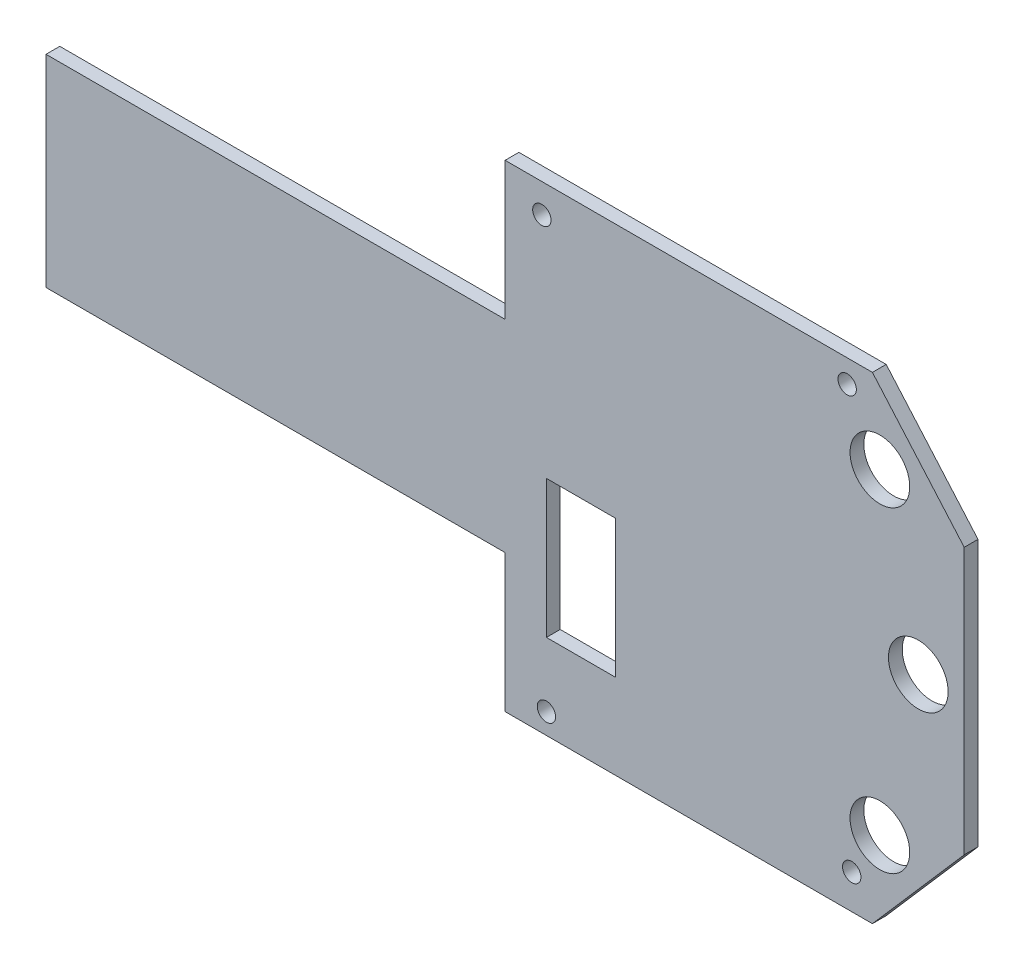
ISO-10303-21;
HEADER;
FILE_DESCRIPTION(('STEP AP214'),'2;1');
FILE_NAME('part.step','',(''),(''),'','','');
FILE_SCHEMA(('AUTOMOTIVE_DESIGN { 1 0 10303 214 1 1 1 1 }'));
ENDSEC;
DATA;
#1=APPLICATION_CONTEXT('core data for automotive mechanical design processes');
#2=APPLICATION_PROTOCOL_DEFINITION('international standard','automotive_design',2000,#1);
#3=PRODUCT_CONTEXT('',#1,'mechanical');
#4=PRODUCT('Part','Part','',(#3));
#5=PRODUCT_RELATED_PRODUCT_CATEGORY('part','',(#4));
#6=PRODUCT_DEFINITION_FORMATION('','',#4);
#7=PRODUCT_DEFINITION_CONTEXT('part definition',#1,'design');
#8=PRODUCT_DEFINITION('design','',#6,#7);
#9=PRODUCT_DEFINITION_SHAPE('','',#8);
#10=(LENGTH_UNIT() NAMED_UNIT(*) SI_UNIT(.MILLI.,.METRE.));
#11=(NAMED_UNIT(*) PLANE_ANGLE_UNIT() SI_UNIT($,.RADIAN.));
#12=(NAMED_UNIT(*) SI_UNIT($,.STERADIAN.) SOLID_ANGLE_UNIT());
#13=UNCERTAINTY_MEASURE_WITH_UNIT(LENGTH_MEASURE(1.E-05),#10,'distance_accuracy_value','');
#14=(GEOMETRIC_REPRESENTATION_CONTEXT(3) GLOBAL_UNCERTAINTY_ASSIGNED_CONTEXT((#13)) GLOBAL_UNIT_ASSIGNED_CONTEXT((#10,
#11,#12)) REPRESENTATION_CONTEXT('',''));
#15=CARTESIAN_POINT('',(0.,0.,0.));
#16=DIRECTION('',(0.,0.,1.));
#17=DIRECTION('',(1.,0.,0.));
#18=AXIS2_PLACEMENT_3D('',#15,#16,#17);
#19=CARTESIAN_POINT('',(100.,104.,3.));
#20=DIRECTION('',(1.,0.,0.));
#21=DIRECTION('',(0.,0.,-1.));
#22=AXIS2_PLACEMENT_3D('',#19,#20,#21);
#23=PLANE('',#22);
#24=DIRECTION('',(0.,-1.,0.));
#25=VECTOR('',#24,1.);
#26=CARTESIAN_POINT('',(100.,104.,0.));
#27=LINE('',#26,#25);
#28=CARTESIAN_POINT('',(100.,104.,0.));
#29=VERTEX_POINT('',#28);
#30=CARTESIAN_POINT('',(100.,74.,0.));
#31=VERTEX_POINT('',#30);
#32=EDGE_CURVE('E178',#29,#31,#27,.T.);
#33=ORIENTED_EDGE('',*,*,#32,.T.);
#34=DIRECTION('',(0.,0.,-1.));
#35=VECTOR('',#34,1.);
#36=CARTESIAN_POINT('',(100.,74.,3.));
#37=LINE('',#36,#35);
#38=CARTESIAN_POINT('',(100.,74.,3.));
#39=VERTEX_POINT('',#38);
#40=EDGE_CURVE('E280',#39,#31,#37,.T.);
#41=ORIENTED_EDGE('',*,*,#40,.F.);
#42=DIRECTION('',(0.,-1.,0.));
#43=VECTOR('',#42,1.);
#44=CARTESIAN_POINT('',(100.,104.,3.));
#45=LINE('',#44,#43);
#46=CARTESIAN_POINT('',(100.,104.,3.));
#47=VERTEX_POINT('',#46);
#48=EDGE_CURVE('E183',#47,#39,#45,.T.);
#49=ORIENTED_EDGE('',*,*,#48,.F.);
#50=DIRECTION('',(0.,0.,-1.));
#51=VECTOR('',#50,1.);
#52=CARTESIAN_POINT('',(100.,104.,3.));
#53=LINE('',#52,#51);
#54=EDGE_CURVE('E215',#47,#29,#53,.T.);
#55=ORIENTED_EDGE('',*,*,#54,.T.);
#56=EDGE_LOOP('',(#33,#41,#49,#55));
#57=FACE_BOUND('',#56,.T.);
#58=ADVANCED_FACE('F44',(#57),#23,.F.);
#59=CARTESIAN_POINT('',(0.,74.,3.));
#60=DIRECTION('',(0.,-1.,0.));
#61=DIRECTION('',(0.,0.,-1.));
#62=AXIS2_PLACEMENT_3D('',#59,#60,#61);
#63=PLANE('',#62);
#64=DIRECTION('',(-1.,0.,0.));
#65=VECTOR('',#64,1.);
#66=CARTESIAN_POINT('',(0.,74.,0.));
#67=LINE('',#66,#65);
#68=CARTESIAN_POINT('',(0.,74.,0.));
#69=VERTEX_POINT('',#68);
#70=EDGE_CURVE('E219',#31,#69,#67,.T.);
#71=ORIENTED_EDGE('',*,*,#70,.T.);
#72=DIRECTION('',(0.,0.,-1.));
#73=VECTOR('',#72,1.);
#74=CARTESIAN_POINT('',(0.,74.,3.));
#75=LINE('',#74,#73);
#76=CARTESIAN_POINT('',(0.,74.,3.));
#77=VERTEX_POINT('',#76);
#78=EDGE_CURVE('E276',#77,#69,#75,.T.);
#79=ORIENTED_EDGE('',*,*,#78,.F.);
#80=DIRECTION('',(-1.,0.,0.));
#81=VECTOR('',#80,1.);
#82=CARTESIAN_POINT('',(0.,74.,3.));
#83=LINE('',#82,#81);
#84=EDGE_CURVE('E187',#39,#77,#83,.T.);
#85=ORIENTED_EDGE('',*,*,#84,.F.);
#86=ORIENTED_EDGE('',*,*,#40,.T.);
#87=EDGE_LOOP('',(#71,#79,#85,#86));
#88=FACE_BOUND('',#87,.T.);
#89=ADVANCED_FACE('F364',(#88),#63,.F.);
#90=CARTESIAN_POINT('',(0.,30.,3.));
#91=DIRECTION('',(1.,0.,0.));
#92=DIRECTION('',(0.,0.,-1.));
#93=AXIS2_PLACEMENT_3D('',#90,#91,#92);
#94=PLANE('',#93);
#95=DIRECTION('',(0.,-1.,0.));
#96=VECTOR('',#95,1.);
#97=CARTESIAN_POINT('',(0.,30.,0.));
#98=LINE('',#97,#96);
#99=CARTESIAN_POINT('',(0.,30.,0.));
#100=VERTEX_POINT('',#99);
#101=EDGE_CURVE('E222',#69,#100,#98,.T.);
#102=ORIENTED_EDGE('',*,*,#101,.T.);
#103=DIRECTION('',(0.,0.,-1.));
#104=VECTOR('',#103,1.);
#105=CARTESIAN_POINT('',(0.,30.,3.));
#106=LINE('',#105,#104);
#107=CARTESIAN_POINT('',(0.,30.,3.));
#108=VERTEX_POINT('',#107);
#109=EDGE_CURVE('E272',#108,#100,#106,.T.);
#110=ORIENTED_EDGE('',*,*,#109,.F.);
#111=DIRECTION('',(0.,-1.,0.));
#112=VECTOR('',#111,1.);
#113=CARTESIAN_POINT('',(0.,30.,3.));
#114=LINE('',#113,#112);
#115=EDGE_CURVE('E191',#77,#108,#114,.T.);
#116=ORIENTED_EDGE('',*,*,#115,.F.);
#117=ORIENTED_EDGE('',*,*,#78,.T.);
#118=EDGE_LOOP('',(#102,#110,#116,#117));
#119=FACE_BOUND('',#118,.T.);
#120=ADVANCED_FACE('F369',(#119),#94,.F.);
#121=CARTESIAN_POINT('',(0.,30.,3.));
#122=DIRECTION('',(0.,1.,0.));
#123=DIRECTION('',(0.,0.,1.));
#124=AXIS2_PLACEMENT_3D('',#121,#122,#123);
#125=PLANE('',#124);
#126=DIRECTION('',(1.,0.,0.));
#127=VECTOR('',#126,1.);
#128=CARTESIAN_POINT('',(0.,30.,0.));
#129=LINE('',#128,#127);
#130=CARTESIAN_POINT('',(100.,30.,0.));
#131=VERTEX_POINT('',#130);
#132=EDGE_CURVE('E225',#100,#131,#129,.T.);
#133=ORIENTED_EDGE('',*,*,#132,.T.);
#134=DIRECTION('',(0.,0.,-1.));
#135=VECTOR('',#134,1.);
#136=CARTESIAN_POINT('',(100.,30.,3.));
#137=LINE('',#136,#135);
#138=CARTESIAN_POINT('',(100.,30.,3.));
#139=VERTEX_POINT('',#138);
#140=EDGE_CURVE('E268',#139,#131,#137,.T.);
#141=ORIENTED_EDGE('',*,*,#140,.F.);
#142=DIRECTION('',(1.,0.,0.));
#143=VECTOR('',#142,1.);
#144=CARTESIAN_POINT('',(0.,30.,3.));
#145=LINE('',#144,#143);
#146=EDGE_CURVE('E194',#108,#139,#145,.T.);
#147=ORIENTED_EDGE('',*,*,#146,.F.);
#148=ORIENTED_EDGE('',*,*,#109,.T.);
#149=EDGE_LOOP('',(#133,#141,#147,#148));
#150=FACE_BOUND('',#149,.T.);
#151=ADVANCED_FACE('F409',(#150),#125,.F.);
#152=CARTESIAN_POINT('',(100.,0.,3.));
#153=DIRECTION('',(1.,0.,0.));
#154=DIRECTION('',(0.,0.,-1.));
#155=AXIS2_PLACEMENT_3D('',#152,#153,#154);
#156=PLANE('',#155);
#157=DIRECTION('',(0.,-1.,0.));
#158=VECTOR('',#157,1.);
#159=CARTESIAN_POINT('',(100.,0.,0.));
#160=LINE('',#159,#158);
#161=CARTESIAN_POINT('',(100.,0.,0.));
#162=VERTEX_POINT('',#161);
#163=EDGE_CURVE('E228',#131,#162,#160,.T.);
#164=ORIENTED_EDGE('',*,*,#163,.T.);
#165=DIRECTION('',(0.,0.,-1.));
#166=VECTOR('',#165,1.);
#167=CARTESIAN_POINT('',(100.,0.,3.));
#168=LINE('',#167,#166);
#169=CARTESIAN_POINT('',(100.,0.,3.));
#170=VERTEX_POINT('',#169);
#171=EDGE_CURVE('E264',#170,#162,#168,.T.);
#172=ORIENTED_EDGE('',*,*,#171,.F.);
#173=DIRECTION('',(0.,-1.,0.));
#174=VECTOR('',#173,1.);
#175=CARTESIAN_POINT('',(100.,0.,3.));
#176=LINE('',#175,#174);
#177=EDGE_CURVE('E197',#139,#170,#176,.T.);
#178=ORIENTED_EDGE('',*,*,#177,.F.);
#179=ORIENTED_EDGE('',*,*,#140,.T.);
#180=EDGE_LOOP('',(#164,#172,#178,#179));
#181=FACE_BOUND('',#180,.T.);
#182=ADVANCED_FACE('F404',(#181),#156,.F.);
#183=CARTESIAN_POINT('',(100.,0.,3.));
#184=DIRECTION('',(0.,1.,0.));
#185=DIRECTION('',(-1.,0.,0.));
#186=AXIS2_PLACEMENT_3D('',#183,#184,#185);
#187=PLANE('',#186);
#188=DIRECTION('',(1.,0.,0.));
#189=VECTOR('',#188,1.);
#190=CARTESIAN_POINT('',(100.,0.,0.));
#191=LINE('',#190,#189);
#192=CARTESIAN_POINT('',(180.,0.,0.));
#193=VERTEX_POINT('',#192);
#194=EDGE_CURVE('E231',#162,#193,#191,.T.);
#195=ORIENTED_EDGE('',*,*,#194,.T.);
#196=DIRECTION('',(0.,0.,-1.));
#197=VECTOR('',#196,1.);
#198=CARTESIAN_POINT('',(180.,0.,3.));
#199=LINE('',#198,#197);
#200=CARTESIAN_POINT('',(180.,0.,3.));
#201=VERTEX_POINT('',#200);
#202=EDGE_CURVE('E260',#201,#193,#199,.T.);
#203=ORIENTED_EDGE('',*,*,#202,.F.);
#204=DIRECTION('',(1.,0.,0.));
#205=VECTOR('',#204,1.);
#206=CARTESIAN_POINT('',(100.,0.,3.));
#207=LINE('',#206,#205);
#208=EDGE_CURVE('E200',#170,#201,#207,.T.);
#209=ORIENTED_EDGE('',*,*,#208,.F.);
#210=ORIENTED_EDGE('',*,*,#171,.T.);
#211=EDGE_LOOP('',(#195,#203,#209,#210));
#212=FACE_BOUND('',#211,.T.);
#213=ADVANCED_FACE('F400',(#212),#187,.F.);
#214=CARTESIAN_POINT('',(200.,23.,3.));
#215=DIRECTION('',(-0.754605522163505,0.656178714924787,0.));
#216=DIRECTION('',(-0.656178714924787,-0.754605522163505,0.));
#217=AXIS2_PLACEMENT_3D('',#214,#215,#216);
#218=PLANE('',#217);
#219=DIRECTION('',(0.656178714924787,0.754605522163505,0.));
#220=VECTOR('',#219,1.);
#221=CARTESIAN_POINT('',(200.,23.,0.));
#222=LINE('',#221,#220);
#223=CARTESIAN_POINT('',(200.,23.,0.));
#224=VERTEX_POINT('',#223);
#225=EDGE_CURVE('E234',#193,#224,#222,.T.);
#226=ORIENTED_EDGE('',*,*,#225,.T.);
#227=DIRECTION('',(0.,0.,-1.));
#228=VECTOR('',#227,1.);
#229=CARTESIAN_POINT('',(200.,23.,3.));
#230=LINE('',#229,#228);
#231=CARTESIAN_POINT('',(200.,23.,3.));
#232=VERTEX_POINT('',#231);
#233=EDGE_CURVE('E256',#232,#224,#230,.T.);
#234=ORIENTED_EDGE('',*,*,#233,.F.);
#235=DIRECTION('',(0.656178714924787,0.754605522163505,0.));
#236=VECTOR('',#235,1.);
#237=CARTESIAN_POINT('',(200.,23.,3.));
#238=LINE('',#237,#236);
#239=EDGE_CURVE('E203',#201,#232,#238,.T.);
#240=ORIENTED_EDGE('',*,*,#239,.F.);
#241=ORIENTED_EDGE('',*,*,#202,.T.);
#242=EDGE_LOOP('',(#226,#234,#240,#241));
#243=FACE_BOUND('',#242,.T.);
#244=ADVANCED_FACE('F396',(#243),#218,.F.);
#245=CARTESIAN_POINT('',(200.,23.,3.));
#246=DIRECTION('',(-1.,0.,0.));
#247=DIRECTION('',(0.,0.,1.));
#248=AXIS2_PLACEMENT_3D('',#245,#246,#247);
#249=PLANE('',#248);
#250=DIRECTION('',(0.,1.,0.));
#251=VECTOR('',#250,1.);
#252=CARTESIAN_POINT('',(200.,23.,0.));
#253=LINE('',#252,#251);
#254=CARTESIAN_POINT('',(200.,81.,0.));
#255=VERTEX_POINT('',#254);
#256=EDGE_CURVE('E237',#224,#255,#253,.T.);
#257=ORIENTED_EDGE('',*,*,#256,.T.);
#258=DIRECTION('',(0.,0.,-1.));
#259=VECTOR('',#258,1.);
#260=CARTESIAN_POINT('',(200.,81.,3.));
#261=LINE('',#260,#259);
#262=CARTESIAN_POINT('',(200.,81.,3.));
#263=VERTEX_POINT('',#262);
#264=EDGE_CURVE('E252',#263,#255,#261,.T.);
#265=ORIENTED_EDGE('',*,*,#264,.F.);
#266=DIRECTION('',(0.,1.,0.));
#267=VECTOR('',#266,1.);
#268=CARTESIAN_POINT('',(200.,23.,3.));
#269=LINE('',#268,#267);
#270=EDGE_CURVE('E206',#232,#263,#269,.T.);
#271=ORIENTED_EDGE('',*,*,#270,.F.);
#272=ORIENTED_EDGE('',*,*,#233,.T.);
#273=EDGE_LOOP('',(#257,#265,#271,#272));
#274=FACE_BOUND('',#273,.T.);
#275=ADVANCED_FACE('F391',(#274),#249,.F.);
#276=CARTESIAN_POINT('',(200.,81.,3.));
#277=DIRECTION('',(-0.754605522163505,-0.656178714924787,0.));
#278=DIRECTION('',(0.656178714924787,-0.754605522163505,0.));
#279=AXIS2_PLACEMENT_3D('',#276,#277,#278);
#280=PLANE('',#279);
#281=DIRECTION('',(-0.656178714924787,0.754605522163505,0.));
#282=VECTOR('',#281,1.);
#283=CARTESIAN_POINT('',(200.,81.,0.));
#284=LINE('',#283,#282);
#285=CARTESIAN_POINT('',(180.,104.,0.));
#286=VERTEX_POINT('',#285);
#287=EDGE_CURVE('E240',#255,#286,#284,.T.);
#288=ORIENTED_EDGE('',*,*,#287,.T.);
#289=DIRECTION('',(0.,0.,-1.));
#290=VECTOR('',#289,1.);
#291=CARTESIAN_POINT('',(180.,104.,3.));
#292=LINE('',#291,#290);
#293=CARTESIAN_POINT('',(180.,104.,3.));
#294=VERTEX_POINT('',#293);
#295=EDGE_CURVE('E248',#294,#286,#292,.T.);
#296=ORIENTED_EDGE('',*,*,#295,.F.);
#297=DIRECTION('',(-0.656178714924787,0.754605522163505,0.));
#298=VECTOR('',#297,1.);
#299=CARTESIAN_POINT('',(200.,81.,3.));
#300=LINE('',#299,#298);
#301=EDGE_CURVE('E209',#263,#294,#300,.T.);
#302=ORIENTED_EDGE('',*,*,#301,.F.);
#303=ORIENTED_EDGE('',*,*,#264,.T.);
#304=EDGE_LOOP('',(#288,#296,#302,#303));
#305=FACE_BOUND('',#304,.T.);
#306=ADVANCED_FACE('F357',(#305),#280,.F.);
#307=CARTESIAN_POINT('',(100.,104.,3.));
#308=DIRECTION('',(0.,-1.,0.));
#309=DIRECTION('',(0.,0.,-1.));
#310=AXIS2_PLACEMENT_3D('',#307,#308,#309);
#311=PLANE('',#310);
#312=DIRECTION('',(-1.,0.,0.));
#313=VECTOR('',#312,1.);
#314=CARTESIAN_POINT('',(100.,104.,0.));
#315=LINE('',#314,#313);
#316=EDGE_CURVE('E188',#286,#29,#315,.T.);
#317=ORIENTED_EDGE('',*,*,#316,.T.);
#318=ORIENTED_EDGE('',*,*,#54,.F.);
#319=DIRECTION('',(-1.,0.,0.));
#320=VECTOR('',#319,1.);
#321=CARTESIAN_POINT('',(100.,104.,3.));
#322=LINE('',#321,#320);
#323=EDGE_CURVE('E212',#294,#47,#322,.T.);
#324=ORIENTED_EDGE('',*,*,#323,.F.);
#325=ORIENTED_EDGE('',*,*,#295,.T.);
#326=EDGE_LOOP('',(#317,#318,#324,#325));
#327=FACE_BOUND('',#326,.T.);
#328=ADVANCED_FACE('F346',(#327),#311,.F.);
#329=CARTESIAN_POINT('',(0.,0.,3.));
#330=DIRECTION('',(0.,0.,1.));
#331=DIRECTION('',(1.,0.,0.));
#332=AXIS2_PLACEMENT_3D('',#329,#330,#331);
#333=PLANE('',#332);
#334=CARTESIAN_POINT('',(189.996600265341,52.,3.));
#335=DIRECTION('',(0.,0.,1.));
#336=DIRECTION('',(1.,0.,0.));
#337=AXIS2_PLACEMENT_3D('',#334,#335,#336);
#338=CIRCLE('',#337,6.50000000000001);
#339=CARTESIAN_POINT('',(196.496600265341,52.,3.));
#340=VERTEX_POINT('',#339);
#341=EDGE_CURVE('E687',#340,#340,#338,.T.);
#342=ORIENTED_EDGE('',*,*,#341,.F.);
#343=EDGE_LOOP('',(#342));
#344=FACE_BOUND('',#343,.T.);
#345=CARTESIAN_POINT('',(181.63,86.5,3.));
#346=DIRECTION('',(0.,0.,1.));
#347=DIRECTION('',(1.,0.,0.));
#348=AXIS2_PLACEMENT_3D('',#345,#346,#347);
#349=CIRCLE('',#348,6.50000000000002);
#350=CARTESIAN_POINT('',(188.13,86.5,3.));
#351=VERTEX_POINT('',#350);
#352=EDGE_CURVE('E316',#351,#351,#349,.T.);
#353=ORIENTED_EDGE('',*,*,#352,.F.);
#354=EDGE_LOOP('',(#353));
#355=FACE_BOUND('',#354,.T.);
#356=CARTESIAN_POINT('',(181.63,17.5,3.));
#357=DIRECTION('',(0.,0.,1.));
#358=DIRECTION('',(-1.,0.,0.));
#359=AXIS2_PLACEMENT_3D('',#356,#357,#358);
#360=CIRCLE('',#359,6.50000000000002);
#361=CARTESIAN_POINT('',(175.13,17.5,3.));
#362=VERTEX_POINT('',#361);
#363=EDGE_CURVE('E328',#362,#362,#360,.T.);
#364=ORIENTED_EDGE('',*,*,#363,.F.);
#365=EDGE_LOOP('',(#364));
#366=FACE_BOUND('',#365,.T.);
#367=CARTESIAN_POINT('',(174.5,99.,3.));
#368=DIRECTION('',(0.,0.,1.));
#369=DIRECTION('',(1.,0.,0.));
#370=AXIS2_PLACEMENT_3D('',#367,#368,#369);
#371=CIRCLE('',#370,2.);
#372=CARTESIAN_POINT('',(176.5,99.,3.));
#373=VERTEX_POINT('',#372);
#374=EDGE_CURVE('E311',#373,#373,#371,.T.);
#375=ORIENTED_EDGE('',*,*,#374,.F.);
#376=EDGE_LOOP('',(#375));
#377=FACE_BOUND('',#376,.T.);
#378=CARTESIAN_POINT('',(108.,97.7,3.));
#379=DIRECTION('',(0.,0.,1.));
#380=DIRECTION('',(1.,0.,0.));
#381=AXIS2_PLACEMENT_3D('',#378,#379,#380);
#382=CIRCLE('',#381,2.);
#383=CARTESIAN_POINT('',(110.,97.7,3.));
#384=VERTEX_POINT('',#383);
#385=EDGE_CURVE('E306',#384,#384,#382,.T.);
#386=ORIENTED_EDGE('',*,*,#385,.F.);
#387=EDGE_LOOP('',(#386));
#388=FACE_BOUND('',#387,.T.);
#389=CARTESIAN_POINT('',(175.5,7.49999999999997,3.));
#390=DIRECTION('',(0.,0.,1.));
#391=DIRECTION('',(1.,0.,0.));
#392=AXIS2_PLACEMENT_3D('',#389,#390,#391);
#393=CIRCLE('',#392,2.);
#394=CARTESIAN_POINT('',(177.5,7.49999999999997,3.));
#395=VERTEX_POINT('',#394);
#396=EDGE_CURVE('E301',#395,#395,#393,.T.);
#397=ORIENTED_EDGE('',*,*,#396,.F.);
#398=EDGE_LOOP('',(#397));
#399=FACE_BOUND('',#398,.T.);
#400=CARTESIAN_POINT('',(109.,4.49999999999997,3.));
#401=DIRECTION('',(0.,0.,1.));
#402=DIRECTION('',(1.,0.,0.));
#403=AXIS2_PLACEMENT_3D('',#400,#401,#402);
#404=CIRCLE('',#403,2.);
#405=CARTESIAN_POINT('',(111.,4.49999999999997,3.));
#406=VERTEX_POINT('',#405);
#407=EDGE_CURVE('E296',#406,#406,#404,.T.);
#408=ORIENTED_EDGE('',*,*,#407,.F.);
#409=EDGE_LOOP('',(#408));
#410=FACE_BOUND('',#409,.T.);
#411=DIRECTION('',(0.,-1.,0.));
#412=VECTOR('',#411,1.);
#413=CARTESIAN_POINT('',(109.,48.5,3.));
#414=LINE('',#413,#412);
#415=CARTESIAN_POINT('',(109.,48.5,3.));
#416=VERTEX_POINT('',#415);
#417=CARTESIAN_POINT('',(109.,18.5,3.));
#418=VERTEX_POINT('',#417);
#419=EDGE_CURVE('E61',#416,#418,#414,.T.);
#420=ORIENTED_EDGE('',*,*,#419,.F.);
#421=DIRECTION('',(-1.,0.,0.));
#422=VECTOR('',#421,1.);
#423=CARTESIAN_POINT('',(109.,48.5,3.));
#424=LINE('',#423,#422);
#425=CARTESIAN_POINT('',(124.,48.5,3.));
#426=VERTEX_POINT('',#425);
#427=EDGE_CURVE('E168',#426,#416,#424,.T.);
#428=ORIENTED_EDGE('',*,*,#427,.F.);
#429=DIRECTION('',(0.,1.,0.));
#430=VECTOR('',#429,1.);
#431=CARTESIAN_POINT('',(124.,48.5,3.));
#432=LINE('',#431,#430);
#433=CARTESIAN_POINT('',(124.,18.5,3.));
#434=VERTEX_POINT('',#433);
#435=EDGE_CURVE('E150',#434,#426,#432,.T.);
#436=ORIENTED_EDGE('',*,*,#435,.F.);
#437=DIRECTION('',(1.,0.,0.));
#438=VECTOR('',#437,1.);
#439=CARTESIAN_POINT('',(109.,18.5,3.));
#440=LINE('',#439,#438);
#441=EDGE_CURVE('E160',#418,#434,#440,.T.);
#442=ORIENTED_EDGE('',*,*,#441,.F.);
#443=EDGE_LOOP('',(#420,#428,#436,#442));
#444=FACE_BOUND('',#443,.T.);
#445=ORIENTED_EDGE('',*,*,#48,.T.);
#446=ORIENTED_EDGE('',*,*,#84,.T.);
#447=ORIENTED_EDGE('',*,*,#115,.T.);
#448=ORIENTED_EDGE('',*,*,#146,.T.);
#449=ORIENTED_EDGE('',*,*,#177,.T.);
#450=ORIENTED_EDGE('',*,*,#208,.T.);
#451=ORIENTED_EDGE('',*,*,#239,.T.);
#452=ORIENTED_EDGE('',*,*,#270,.T.);
#453=ORIENTED_EDGE('',*,*,#301,.T.);
#454=ORIENTED_EDGE('',*,*,#323,.T.);
#455=EDGE_LOOP('',(#445,#446,#447,#448,#449,#450,#451,#452,#453,#454));
#456=FACE_BOUND('',#455,.T.);
#457=ADVANCED_FACE('F165',(#344,#355,#366,#377,#388,#399,#410,#444,#456),#333,.T.);
#458=CARTESIAN_POINT('',(0.,0.,0.));
#459=DIRECTION('',(0.,0.,1.));
#460=DIRECTION('',(1.,0.,0.));
#461=AXIS2_PLACEMENT_3D('',#458,#459,#460);
#462=PLANE('',#461);
#463=CARTESIAN_POINT('',(189.996600265341,52.,0.));
#464=DIRECTION('',(0.,0.,1.));
#465=DIRECTION('',(1.,0.,0.));
#466=AXIS2_PLACEMENT_3D('',#463,#464,#465);
#467=CIRCLE('',#466,6.50000000000001);
#468=CARTESIAN_POINT('',(196.496600265341,52.,0.));
#469=VERTEX_POINT('',#468);
#470=EDGE_CURVE('E47',#469,#469,#467,.T.);
#471=ORIENTED_EDGE('',*,*,#470,.T.);
#472=EDGE_LOOP('',(#471));
#473=FACE_BOUND('',#472,.T.);
#474=CARTESIAN_POINT('',(181.63,86.5,0.));
#475=DIRECTION('',(0.,0.,1.));
#476=DIRECTION('',(1.,0.,0.));
#477=AXIS2_PLACEMENT_3D('',#474,#475,#476);
#478=CIRCLE('',#477,6.50000000000002);
#479=CARTESIAN_POINT('',(188.13,86.5,0.));
#480=VERTEX_POINT('',#479);
#481=EDGE_CURVE('E315',#480,#480,#478,.T.);
#482=ORIENTED_EDGE('',*,*,#481,.T.);
#483=EDGE_LOOP('',(#482));
#484=FACE_BOUND('',#483,.T.);
#485=CARTESIAN_POINT('',(181.63,17.5,0.));
#486=DIRECTION('',(0.,0.,1.));
#487=DIRECTION('',(1.,0.,0.));
#488=AXIS2_PLACEMENT_3D('',#485,#486,#487);
#489=CIRCLE('',#488,6.50000000000002);
#490=CARTESIAN_POINT('',(188.13,17.5,0.));
#491=VERTEX_POINT('',#490);
#492=EDGE_CURVE('E312',#491,#491,#489,.T.);
#493=ORIENTED_EDGE('',*,*,#492,.T.);
#494=EDGE_LOOP('',(#493));
#495=FACE_BOUND('',#494,.T.);
#496=CARTESIAN_POINT('',(174.5,99.,0.));
#497=DIRECTION('',(0.,0.,1.));
#498=DIRECTION('',(1.,0.,0.));
#499=AXIS2_PLACEMENT_3D('',#496,#497,#498);
#500=CIRCLE('',#499,2.);
#501=CARTESIAN_POINT('',(176.5,99.,0.));
#502=VERTEX_POINT('',#501);
#503=EDGE_CURVE('E307',#502,#502,#500,.T.);
#504=ORIENTED_EDGE('',*,*,#503,.T.);
#505=EDGE_LOOP('',(#504));
#506=FACE_BOUND('',#505,.T.);
#507=CARTESIAN_POINT('',(108.,97.7,0.));
#508=DIRECTION('',(0.,0.,1.));
#509=DIRECTION('',(1.,0.,0.));
#510=AXIS2_PLACEMENT_3D('',#507,#508,#509);
#511=CIRCLE('',#510,2.);
#512=CARTESIAN_POINT('',(110.,97.7,0.));
#513=VERTEX_POINT('',#512);
#514=EDGE_CURVE('E302',#513,#513,#511,.T.);
#515=ORIENTED_EDGE('',*,*,#514,.T.);
#516=EDGE_LOOP('',(#515));
#517=FACE_BOUND('',#516,.T.);
#518=CARTESIAN_POINT('',(175.5,7.49999999999997,0.));
#519=DIRECTION('',(0.,0.,1.));
#520=DIRECTION('',(1.,0.,0.));
#521=AXIS2_PLACEMENT_3D('',#518,#519,#520);
#522=CIRCLE('',#521,2.);
#523=CARTESIAN_POINT('',(177.5,7.49999999999997,0.));
#524=VERTEX_POINT('',#523);
#525=EDGE_CURVE('E297',#524,#524,#522,.T.);
#526=ORIENTED_EDGE('',*,*,#525,.T.);
#527=EDGE_LOOP('',(#526));
#528=FACE_BOUND('',#527,.T.);
#529=CARTESIAN_POINT('',(109.,4.49999999999997,0.));
#530=DIRECTION('',(0.,0.,1.));
#531=DIRECTION('',(1.,0.,0.));
#532=AXIS2_PLACEMENT_3D('',#529,#530,#531);
#533=CIRCLE('',#532,2.);
#534=CARTESIAN_POINT('',(111.,4.49999999999997,0.));
#535=VERTEX_POINT('',#534);
#536=EDGE_CURVE('E292',#535,#535,#533,.T.);
#537=ORIENTED_EDGE('',*,*,#536,.T.);
#538=EDGE_LOOP('',(#537));
#539=FACE_BOUND('',#538,.T.);
#540=DIRECTION('',(-1.,0.,0.));
#541=VECTOR('',#540,1.);
#542=CARTESIAN_POINT('',(0.,48.5,0.));
#543=LINE('',#542,#541);
#544=CARTESIAN_POINT('',(124.,48.5,0.));
#545=VERTEX_POINT('',#544);
#546=CARTESIAN_POINT('',(109.,48.5,0.));
#547=VERTEX_POINT('',#546);
#548=EDGE_CURVE('E53',#545,#547,#543,.T.);
#549=ORIENTED_EDGE('',*,*,#548,.T.);
#550=DIRECTION('',(0.,-1.,0.));
#551=VECTOR('',#550,1.);
#552=CARTESIAN_POINT('',(109.,0.,0.));
#553=LINE('',#552,#551);
#554=CARTESIAN_POINT('',(109.,18.5,0.));
#555=VERTEX_POINT('',#554);
#556=EDGE_CURVE('E11',#547,#555,#553,.T.);
#557=ORIENTED_EDGE('',*,*,#556,.T.);
#558=DIRECTION('',(1.,0.,0.));
#559=VECTOR('',#558,1.);
#560=CARTESIAN_POINT('',(0.,18.5,0.));
#561=LINE('',#560,#559);
#562=CARTESIAN_POINT('',(124.,18.5,0.));
#563=VERTEX_POINT('',#562);
#564=EDGE_CURVE('E284',#555,#563,#561,.T.);
#565=ORIENTED_EDGE('',*,*,#564,.T.);
#566=DIRECTION('',(0.,1.,0.));
#567=VECTOR('',#566,1.);
#568=CARTESIAN_POINT('',(124.,0.,0.));
#569=LINE('',#568,#567);
#570=EDGE_CURVE('E153',#563,#545,#569,.T.);
#571=ORIENTED_EDGE('',*,*,#570,.T.);
#572=EDGE_LOOP('',(#549,#557,#565,#571));
#573=FACE_BOUND('',#572,.T.);
#574=ORIENTED_EDGE('',*,*,#32,.F.);
#575=ORIENTED_EDGE('',*,*,#316,.F.);
#576=ORIENTED_EDGE('',*,*,#287,.F.);
#577=ORIENTED_EDGE('',*,*,#256,.F.);
#578=ORIENTED_EDGE('',*,*,#225,.F.);
#579=ORIENTED_EDGE('',*,*,#194,.F.);
#580=ORIENTED_EDGE('',*,*,#163,.F.);
#581=ORIENTED_EDGE('',*,*,#132,.F.);
#582=ORIENTED_EDGE('',*,*,#101,.F.);
#583=ORIENTED_EDGE('',*,*,#70,.F.);
#584=EDGE_LOOP('',(#574,#575,#576,#577,#578,#579,#580,#581,#582,#583));
#585=FACE_BOUND('',#584,.T.);
#586=ADVANCED_FACE('F345',(#473,#484,#495,#506,#517,#528,#539,#573,#585),#462,.F.);
#587=CARTESIAN_POINT('',(109.,48.5,-7.));
#588=DIRECTION('',(-1.,0.,0.));
#589=DIRECTION('',(0.,0.,1.));
#590=AXIS2_PLACEMENT_3D('',#587,#588,#589);
#591=PLANE('',#590);
#592=DIRECTION('',(0.,0.,1.));
#593=VECTOR('',#592,1.);
#594=CARTESIAN_POINT('',(109.,48.5,-7.));
#595=LINE('',#594,#593);
#596=EDGE_CURVE('E175',#547,#416,#595,.T.);
#597=ORIENTED_EDGE('',*,*,#596,.T.);
#598=ORIENTED_EDGE('',*,*,#419,.T.);
#599=DIRECTION('',(0.,0.,1.));
#600=VECTOR('',#599,1.);
#601=CARTESIAN_POINT('',(109.,18.5,-7.));
#602=LINE('',#601,#600);
#603=EDGE_CURVE('E157',#555,#418,#602,.T.);
#604=ORIENTED_EDGE('',*,*,#603,.F.);
#605=ORIENTED_EDGE('',*,*,#556,.F.);
#606=EDGE_LOOP('',(#597,#598,#604,#605));
#607=FACE_BOUND('',#606,.T.);
#608=ADVANCED_FACE('F353',(#607),#591,.F.);
#609=CARTESIAN_POINT('',(109.,48.5,-7.));
#610=DIRECTION('',(0.,1.,0.));
#611=DIRECTION('',(0.,0.,1.));
#612=AXIS2_PLACEMENT_3D('',#609,#610,#611);
#613=PLANE('',#612);
#614=DIRECTION('',(0.,0.,1.));
#615=VECTOR('',#614,1.);
#616=CARTESIAN_POINT('',(124.,48.5,-7.));
#617=LINE('',#616,#615);
#618=EDGE_CURVE('E156',#545,#426,#617,.T.);
#619=ORIENTED_EDGE('',*,*,#618,.T.);
#620=ORIENTED_EDGE('',*,*,#427,.T.);
#621=ORIENTED_EDGE('',*,*,#596,.F.);
#622=ORIENTED_EDGE('',*,*,#548,.F.);
#623=EDGE_LOOP('',(#619,#620,#621,#622));
#624=FACE_BOUND('',#623,.T.);
#625=ADVANCED_FACE('F453',(#624),#613,.F.);
#626=CARTESIAN_POINT('',(124.,48.5,-7.));
#627=DIRECTION('',(1.,0.,0.));
#628=DIRECTION('',(0.,0.,-1.));
#629=AXIS2_PLACEMENT_3D('',#626,#627,#628);
#630=PLANE('',#629);
#631=DIRECTION('',(0.,0.,1.));
#632=VECTOR('',#631,1.);
#633=CARTESIAN_POINT('',(124.,18.5,-7.));
#634=LINE('',#633,#632);
#635=EDGE_CURVE('E69',#563,#434,#634,.T.);
#636=ORIENTED_EDGE('',*,*,#635,.T.);
#637=ORIENTED_EDGE('',*,*,#435,.T.);
#638=ORIENTED_EDGE('',*,*,#618,.F.);
#639=ORIENTED_EDGE('',*,*,#570,.F.);
#640=EDGE_LOOP('',(#636,#637,#638,#639));
#641=FACE_BOUND('',#640,.T.);
#642=ADVANCED_FACE('F147',(#641),#630,.F.);
#643=CARTESIAN_POINT('',(109.,18.5,-7.));
#644=DIRECTION('',(0.,-1.,0.));
#645=DIRECTION('',(0.,0.,-1.));
#646=AXIS2_PLACEMENT_3D('',#643,#644,#645);
#647=PLANE('',#646);
#648=ORIENTED_EDGE('',*,*,#603,.T.);
#649=ORIENTED_EDGE('',*,*,#441,.T.);
#650=ORIENTED_EDGE('',*,*,#635,.F.);
#651=ORIENTED_EDGE('',*,*,#564,.F.);
#652=EDGE_LOOP('',(#648,#649,#650,#651));
#653=FACE_BOUND('',#652,.T.);
#654=ADVANCED_FACE('F161',(#653),#647,.F.);
#655=CARTESIAN_POINT('',(109.,4.49999999999997,-7.));
#656=DIRECTION('',(0.,0.,1.));
#657=DIRECTION('',(1.,0.,0.));
#658=AXIS2_PLACEMENT_3D('',#655,#656,#657);
#659=CYLINDRICAL_SURFACE('',#658,2.);
#660=ORIENTED_EDGE('',*,*,#407,.T.);
#661=EDGE_LOOP('',(#660));
#662=FACE_BOUND('',#661,.T.);
#663=ORIENTED_EDGE('',*,*,#536,.F.);
#664=EDGE_LOOP('',(#663));
#665=FACE_BOUND('',#664,.T.);
#666=ADVANCED_FACE('F341',(#662,#665),#659,.F.);
#667=CARTESIAN_POINT('',(175.5,7.49999999999997,-7.));
#668=DIRECTION('',(0.,0.,1.));
#669=DIRECTION('',(1.,0.,0.));
#670=AXIS2_PLACEMENT_3D('',#667,#668,#669);
#671=CYLINDRICAL_SURFACE('',#670,2.);
#672=ORIENTED_EDGE('',*,*,#396,.T.);
#673=EDGE_LOOP('',(#672));
#674=FACE_BOUND('',#673,.T.);
#675=ORIENTED_EDGE('',*,*,#525,.F.);
#676=EDGE_LOOP('',(#675));
#677=FACE_BOUND('',#676,.T.);
#678=ADVANCED_FACE('F478',(#674,#677),#671,.F.);
#679=CARTESIAN_POINT('',(108.,97.7,-7.));
#680=DIRECTION('',(0.,0.,1.));
#681=DIRECTION('',(1.,0.,0.));
#682=AXIS2_PLACEMENT_3D('',#679,#680,#681);
#683=CYLINDRICAL_SURFACE('',#682,2.);
#684=ORIENTED_EDGE('',*,*,#385,.T.);
#685=EDGE_LOOP('',(#684));
#686=FACE_BOUND('',#685,.T.);
#687=ORIENTED_EDGE('',*,*,#514,.F.);
#688=EDGE_LOOP('',(#687));
#689=FACE_BOUND('',#688,.T.);
#690=ADVANCED_FACE('F485',(#686,#689),#683,.F.);
#691=CARTESIAN_POINT('',(174.5,99.,-7.));
#692=DIRECTION('',(0.,0.,1.));
#693=DIRECTION('',(1.,0.,0.));
#694=AXIS2_PLACEMENT_3D('',#691,#692,#693);
#695=CYLINDRICAL_SURFACE('',#694,2.);
#696=ORIENTED_EDGE('',*,*,#374,.T.);
#697=EDGE_LOOP('',(#696));
#698=FACE_BOUND('',#697,.T.);
#699=ORIENTED_EDGE('',*,*,#503,.F.);
#700=EDGE_LOOP('',(#699));
#701=FACE_BOUND('',#700,.T.);
#702=ADVANCED_FACE('F493',(#698,#701),#695,.F.);
#703=CARTESIAN_POINT('',(181.63,17.5,-7.));
#704=DIRECTION('',(0.,0.,1.));
#705=DIRECTION('',(1.,0.,0.));
#706=AXIS2_PLACEMENT_3D('',#703,#704,#705);
#707=CYLINDRICAL_SURFACE('',#706,6.50000000000002);
#708=ORIENTED_EDGE('',*,*,#363,.T.);
#709=EDGE_LOOP('',(#708));
#710=FACE_BOUND('',#709,.T.);
#711=ORIENTED_EDGE('',*,*,#492,.F.);
#712=EDGE_LOOP('',(#711));
#713=FACE_BOUND('',#712,.T.);
#714=ADVANCED_FACE('F501',(#710,#713),#707,.F.);
#715=CARTESIAN_POINT('',(181.63,86.5,-7.));
#716=DIRECTION('',(0.,0.,1.));
#717=DIRECTION('',(1.,0.,0.));
#718=AXIS2_PLACEMENT_3D('',#715,#716,#717);
#719=CYLINDRICAL_SURFACE('',#718,6.50000000000002);
#720=ORIENTED_EDGE('',*,*,#352,.T.);
#721=EDGE_LOOP('',(#720));
#722=FACE_BOUND('',#721,.T.);
#723=ORIENTED_EDGE('',*,*,#481,.F.);
#724=EDGE_LOOP('',(#723));
#725=FACE_BOUND('',#724,.T.);
#726=ADVANCED_FACE('F508',(#722,#725),#719,.F.);
#727=CARTESIAN_POINT('',(189.996600265341,52.,-7.));
#728=DIRECTION('',(0.,0.,1.));
#729=DIRECTION('',(1.,0.,0.));
#730=AXIS2_PLACEMENT_3D('',#727,#728,#729);
#731=CYLINDRICAL_SURFACE('',#730,6.50000000000001);
#732=ORIENTED_EDGE('',*,*,#341,.T.);
#733=EDGE_LOOP('',(#732));
#734=FACE_BOUND('',#733,.T.);
#735=ORIENTED_EDGE('',*,*,#470,.F.);
#736=EDGE_LOOP('',(#735));
#737=FACE_BOUND('',#736,.T.);
#738=ADVANCED_FACE('F516',(#734,#737),#731,.F.);
#739=CLOSED_SHELL('',(#58,#89,#120,#151,#182,#213,#244,#275,#306,#328,#457,#586,#608,#625,#642,
#654,#666,#678,#690,#702,#714,#726,#738));
#740=MANIFOLD_SOLID_BREP('B2',#739);
#741=ADVANCED_BREP_SHAPE_REPRESENTATION('',(#18,#740),#14);
#742=SHAPE_DEFINITION_REPRESENTATION(#9,#741);
ENDSEC;
END-ISO-10303-21;
